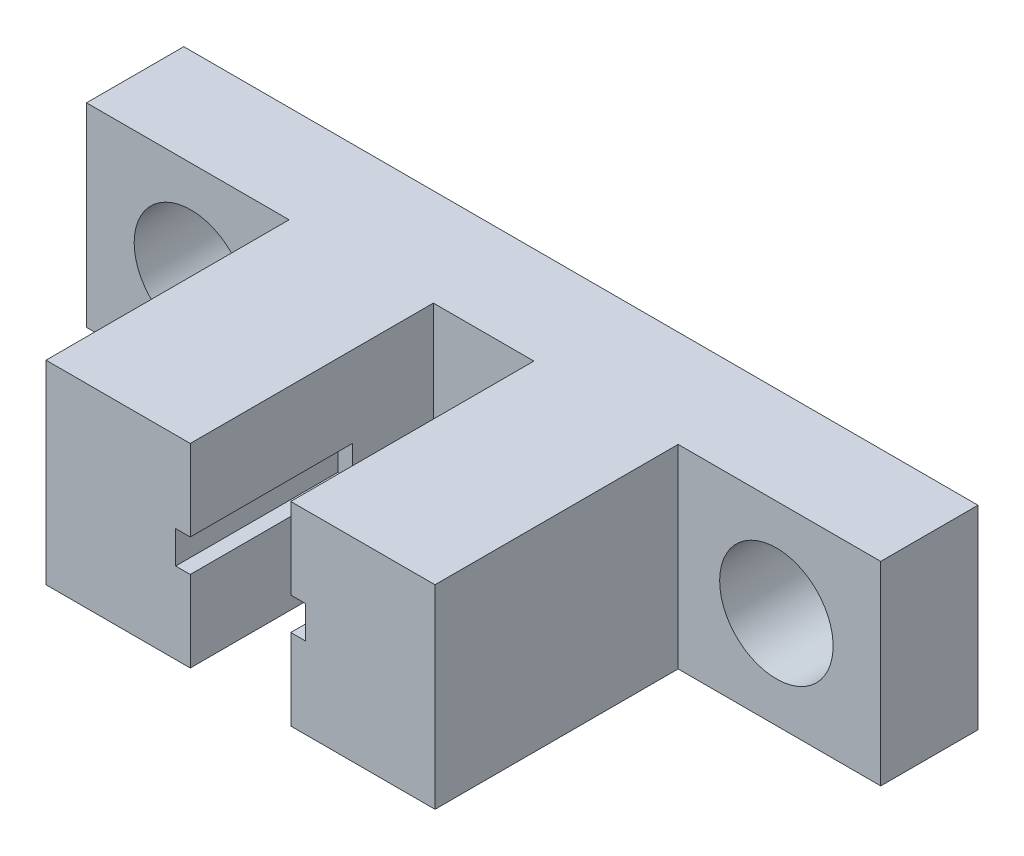
ISO-10303-21;
HEADER;
FILE_DESCRIPTION(('STEP AP214'),'2;1');
FILE_NAME('part.step','',(''),(''),'','','');
FILE_SCHEMA(('AUTOMOTIVE_DESIGN { 1 0 10303 214 1 1 1 1 }'));
ENDSEC;
DATA;
#1=APPLICATION_CONTEXT('core data for automotive mechanical design processes');
#2=APPLICATION_PROTOCOL_DEFINITION('international standard','automotive_design',2000,#1);
#3=PRODUCT_CONTEXT('',#1,'mechanical');
#4=PRODUCT('Part','Part','',(#3));
#5=PRODUCT_RELATED_PRODUCT_CATEGORY('part','',(#4));
#6=PRODUCT_DEFINITION_FORMATION('','',#4);
#7=PRODUCT_DEFINITION_CONTEXT('part definition',#1,'design');
#8=PRODUCT_DEFINITION('design','',#6,#7);
#9=PRODUCT_DEFINITION_SHAPE('','',#8);
#10=(LENGTH_UNIT() NAMED_UNIT(*) SI_UNIT(.MILLI.,.METRE.));
#11=(NAMED_UNIT(*) PLANE_ANGLE_UNIT() SI_UNIT($,.RADIAN.));
#12=(NAMED_UNIT(*) SI_UNIT($,.STERADIAN.) SOLID_ANGLE_UNIT());
#13=UNCERTAINTY_MEASURE_WITH_UNIT(LENGTH_MEASURE(1.E-05),#10,'distance_accuracy_value','');
#14=(GEOMETRIC_REPRESENTATION_CONTEXT(3) GLOBAL_UNCERTAINTY_ASSIGNED_CONTEXT((#13)) GLOBAL_UNIT_ASSIGNED_CONTEXT((#10,
#11,#12)) REPRESENTATION_CONTEXT('',''));
#15=CARTESIAN_POINT('',(0.,0.,0.));
#16=DIRECTION('',(0.,0.,1.));
#17=DIRECTION('',(1.,0.,0.));
#18=AXIS2_PLACEMENT_3D('',#15,#16,#17);
#19=CARTESIAN_POINT('',(0.,0.,0.));
#20=DIRECTION('',(0.,0.,-1.));
#21=DIRECTION('',(-1.,0.,0.));
#22=AXIS2_PLACEMENT_3D('',#19,#20,#21);
#23=PLANE('',#22);
#24=CARTESIAN_POINT('',(9.03033996878473,-1.87794117647056,0.));
#25=DIRECTION('',(0.,0.,-1.));
#26=DIRECTION('',(-1.,0.,0.));
#27=AXIS2_PLACEMENT_3D('',#24,#25,#26);
#28=CIRCLE('',#27,1.75);
#29=CARTESIAN_POINT('',(7.28033996878473,-1.87794117647056,0.));
#30=VERTEX_POINT('',#29);
#31=EDGE_CURVE('E266',#30,#30,#28,.T.);
#32=ORIENTED_EDGE('',*,*,#31,.T.);
#33=EDGE_LOOP('',(#32));
#34=FACE_BOUND('',#33,.T.);
#35=DIRECTION('',(0.,1.,0.));
#36=VECTOR('',#35,1.);
#37=CARTESIAN_POINT('',(6.,0.,0.));
#38=LINE('',#37,#36);
#39=CARTESIAN_POINT('',(6.,-4.87794117647056,0.));
#40=VERTEX_POINT('',#39);
#41=CARTESIAN_POINT('',(6.,1.12205882352944,0.));
#42=VERTEX_POINT('',#41);
#43=EDGE_CURVE('E256',#40,#42,#38,.T.);
#44=ORIENTED_EDGE('',*,*,#43,.F.);
#45=DIRECTION('',(1.,0.,0.));
#46=VECTOR('',#45,1.);
#47=CARTESIAN_POINT('',(0.,-4.87794117647056,0.));
#48=LINE('',#47,#46);
#49=CARTESIAN_POINT('',(12.25,-4.87794117647056,0.));
#50=VERTEX_POINT('',#49);
#51=EDGE_CURVE('E291',#40,#50,#48,.T.);
#52=ORIENTED_EDGE('',*,*,#51,.T.);
#53=DIRECTION('',(0.,1.,0.));
#54=VECTOR('',#53,1.);
#55=CARTESIAN_POINT('',(12.25,0.,0.));
#56=LINE('',#55,#54);
#57=CARTESIAN_POINT('',(12.25,1.12205882352944,0.));
#58=VERTEX_POINT('',#57);
#59=EDGE_CURVE('E288',#50,#58,#56,.T.);
#60=ORIENTED_EDGE('',*,*,#59,.T.);
#61=DIRECTION('',(1.,0.,0.));
#62=VECTOR('',#61,1.);
#63=CARTESIAN_POINT('',(0.,1.12205882352944,0.));
#64=LINE('',#63,#62);
#65=EDGE_CURVE('E298',#42,#58,#64,.T.);
#66=ORIENTED_EDGE('',*,*,#65,.F.);
#67=EDGE_LOOP('',(#44,#52,#60,#66));
#68=FACE_BOUND('',#67,.T.);
#69=ADVANCED_FACE('F51',(#34,#68),#23,.F.);
#70=CARTESIAN_POINT('',(-6.,0.,7.5));
#71=DIRECTION('',(-1.,0.,0.));
#72=DIRECTION('',(0.,0.,1.));
#73=AXIS2_PLACEMENT_3D('',#70,#71,#72);
#74=PLANE('',#73);
#75=DIRECTION('',(0.,1.,0.));
#76=VECTOR('',#75,1.);
#77=CARTESIAN_POINT('',(-6.,0.,0.));
#78=LINE('',#77,#76);
#79=CARTESIAN_POINT('',(-6.,-4.87794117647056,0.));
#80=VERTEX_POINT('',#79);
#81=CARTESIAN_POINT('',(-6.,1.12205882352944,0.));
#82=VERTEX_POINT('',#81);
#83=EDGE_CURVE('E315',#80,#82,#78,.T.);
#84=ORIENTED_EDGE('',*,*,#83,.F.);
#85=DIRECTION('',(0.,0.,-1.));
#86=VECTOR('',#85,1.);
#87=CARTESIAN_POINT('',(-6.,-4.87794117647056,7.5));
#88=LINE('',#87,#86);
#89=CARTESIAN_POINT('',(-6.,-4.87794117647056,7.5));
#90=VERTEX_POINT('',#89);
#91=EDGE_CURVE('E341',#90,#80,#88,.T.);
#92=ORIENTED_EDGE('',*,*,#91,.F.);
#93=DIRECTION('',(0.,1.,0.));
#94=VECTOR('',#93,1.);
#95=CARTESIAN_POINT('',(-6.,0.,7.5));
#96=LINE('',#95,#94);
#97=CARTESIAN_POINT('',(-6.,1.12205882352944,7.5));
#98=VERTEX_POINT('',#97);
#99=EDGE_CURVE('E316',#90,#98,#96,.T.);
#100=ORIENTED_EDGE('',*,*,#99,.T.);
#101=DIRECTION('',(0.,0.,-1.));
#102=VECTOR('',#101,1.);
#103=CARTESIAN_POINT('',(-6.,1.12205882352944,7.5));
#104=LINE('',#103,#102);
#105=EDGE_CURVE('E329',#98,#82,#104,.T.);
#106=ORIENTED_EDGE('',*,*,#105,.T.);
#107=EDGE_LOOP('',(#84,#92,#100,#106));
#108=FACE_BOUND('',#107,.T.);
#109=ADVANCED_FACE('F53',(#108),#74,.T.);
#110=CARTESIAN_POINT('',(0.,-4.87794117647056,7.5));
#111=DIRECTION('',(0.,-1.,0.));
#112=DIRECTION('',(0.,0.,-1.));
#113=AXIS2_PLACEMENT_3D('',#110,#111,#112);
#114=PLANE('',#113);
#115=ORIENTED_EDGE('',*,*,#91,.T.);
#116=CARTESIAN_POINT('',(-12.25,-4.87794117647056,0.));
#117=VERTEX_POINT('',#116);
#118=EDGE_CURVE('E292',#117,#80,#48,.T.);
#119=ORIENTED_EDGE('',*,*,#118,.F.);
#120=DIRECTION('',(0.,0.,1.));
#121=VECTOR('',#120,1.);
#122=CARTESIAN_POINT('',(-12.25,-4.87794117647056,-3.));
#123=LINE('',#122,#121);
#124=CARTESIAN_POINT('',(-12.25,-4.87794117647056,-3.));
#125=VERTEX_POINT('',#124);
#126=EDGE_CURVE('E310',#125,#117,#123,.T.);
#127=ORIENTED_EDGE('',*,*,#126,.F.);
#128=DIRECTION('',(1.,0.,0.));
#129=VECTOR('',#128,1.);
#130=CARTESIAN_POINT('',(0.,-4.87794117647056,-3.));
#131=LINE('',#130,#129);
#132=CARTESIAN_POINT('',(12.25,-4.87794117647056,-3.));
#133=VERTEX_POINT('',#132);
#134=EDGE_CURVE('E274',#125,#133,#131,.T.);
#135=ORIENTED_EDGE('',*,*,#134,.T.);
#136=DIRECTION('',(0.,0.,1.));
#137=VECTOR('',#136,1.);
#138=CARTESIAN_POINT('',(12.25,-4.87794117647056,-3.));
#139=LINE('',#138,#137);
#140=EDGE_CURVE('E312',#133,#50,#139,.T.);
#141=ORIENTED_EDGE('',*,*,#140,.T.);
#142=ORIENTED_EDGE('',*,*,#51,.F.);
#143=DIRECTION('',(0.,0.,-1.));
#144=VECTOR('',#143,1.);
#145=CARTESIAN_POINT('',(6.,-4.87794117647056,7.5));
#146=LINE('',#145,#144);
#147=CARTESIAN_POINT('',(6.,-4.87794117647056,7.5));
#148=VERTEX_POINT('',#147);
#149=EDGE_CURVE('E262',#148,#40,#146,.T.);
#150=ORIENTED_EDGE('',*,*,#149,.F.);
#151=DIRECTION('',(1.,0.,0.));
#152=VECTOR('',#151,1.);
#153=CARTESIAN_POINT('',(0.,-4.87794117647055,7.5));
#154=LINE('',#153,#152);
#155=CARTESIAN_POINT('',(1.55,-4.87794117647055,7.5));
#156=VERTEX_POINT('',#155);
#157=EDGE_CURVE('E245',#156,#148,#154,.T.);
#158=ORIENTED_EDGE('',*,*,#157,.F.);
#159=DIRECTION('',(0.,0.,-1.));
#160=VECTOR('',#159,1.);
#161=CARTESIAN_POINT('',(1.55,-4.87794117647055,7.5));
#162=LINE('',#161,#160);
#163=CARTESIAN_POINT('',(1.55,-4.87794117647055,0.));
#164=VERTEX_POINT('',#163);
#165=EDGE_CURVE('E264',#156,#164,#162,.T.);
#166=ORIENTED_EDGE('',*,*,#165,.T.);
#167=CARTESIAN_POINT('',(-1.55,-4.87794117647056,0.));
#168=VERTEX_POINT('',#167);
#169=EDGE_CURVE('E295',#168,#164,#48,.T.);
#170=ORIENTED_EDGE('',*,*,#169,.F.);
#171=DIRECTION('',(0.,0.,-1.));
#172=VECTOR('',#171,1.);
#173=CARTESIAN_POINT('',(-1.55,-4.87794117647056,7.5));
#174=LINE('',#173,#172);
#175=CARTESIAN_POINT('',(-1.55,-4.87794117647056,7.5));
#176=VERTEX_POINT('',#175);
#177=EDGE_CURVE('E338',#176,#168,#174,.T.);
#178=ORIENTED_EDGE('',*,*,#177,.F.);
#179=DIRECTION('',(-1.,0.,0.));
#180=VECTOR('',#179,1.);
#181=CARTESIAN_POINT('',(0.,-4.87794117647056,7.5));
#182=LINE('',#181,#180);
#183=EDGE_CURVE('E319',#176,#90,#182,.T.);
#184=ORIENTED_EDGE('',*,*,#183,.T.);
#185=EDGE_LOOP('',(#115,#119,#127,#135,#141,#142,#150,#158,#166,#170,#178,#184));
#186=FACE_BOUND('',#185,.T.);
#187=ADVANCED_FACE('F362',(#186),#114,.T.);
#188=CARTESIAN_POINT('',(-1.55,0.,7.5));
#189=DIRECTION('',(-1.,0.,0.));
#190=DIRECTION('',(0.,0.,1.));
#191=AXIS2_PLACEMENT_3D('',#188,#189,#190);
#192=PLANE('',#191);
#193=DIRECTION('',(0.,1.,0.));
#194=VECTOR('',#193,1.);
#195=CARTESIAN_POINT('',(-1.55,0.,2.5));
#196=LINE('',#195,#194);
#197=CARTESIAN_POINT('',(-1.55,-2.37794117647056,2.5));
#198=VERTEX_POINT('',#197);
#199=CARTESIAN_POINT('',(-1.55,-1.37794117647056,2.5));
#200=VERTEX_POINT('',#199);
#201=EDGE_CURVE('E239',#198,#200,#196,.T.);
#202=ORIENTED_EDGE('',*,*,#201,.F.);
#203=DIRECTION('',(0.,0.,1.));
#204=VECTOR('',#203,1.);
#205=CARTESIAN_POINT('',(-1.55,-2.37794117647056,7.5));
#206=LINE('',#205,#204);
#207=CARTESIAN_POINT('',(-1.55,-2.37794117647056,7.5));
#208=VERTEX_POINT('',#207);
#209=EDGE_CURVE('E236',#198,#208,#206,.T.);
#210=ORIENTED_EDGE('',*,*,#209,.T.);
#211=DIRECTION('',(0.,1.,0.));
#212=VECTOR('',#211,1.);
#213=CARTESIAN_POINT('',(-1.55,0.,7.5));
#214=LINE('',#213,#212);
#215=EDGE_CURVE('E324',#176,#208,#214,.T.);
#216=ORIENTED_EDGE('',*,*,#215,.F.);
#217=ORIENTED_EDGE('',*,*,#177,.T.);
#218=DIRECTION('',(0.,1.,0.));
#219=VECTOR('',#218,1.);
#220=CARTESIAN_POINT('',(-1.55,0.,0.));
#221=LINE('',#220,#219);
#222=CARTESIAN_POINT('',(-1.55,1.12205882352945,0.));
#223=VERTEX_POINT('',#222);
#224=EDGE_CURVE('E320',#168,#223,#221,.T.);
#225=ORIENTED_EDGE('',*,*,#224,.T.);
#226=DIRECTION('',(0.,0.,-1.));
#227=VECTOR('',#226,1.);
#228=CARTESIAN_POINT('',(-1.55,1.12205882352945,7.5));
#229=LINE('',#228,#227);
#230=CARTESIAN_POINT('',(-1.55,1.12205882352945,7.5));
#231=VERTEX_POINT('',#230);
#232=EDGE_CURVE('E335',#231,#223,#229,.T.);
#233=ORIENTED_EDGE('',*,*,#232,.F.);
#234=CARTESIAN_POINT('',(-1.55,-1.37794117647056,7.5));
#235=VERTEX_POINT('',#234);
#236=EDGE_CURVE('E323',#235,#231,#214,.T.);
#237=ORIENTED_EDGE('',*,*,#236,.F.);
#238=DIRECTION('',(0.,0.,-1.));
#239=VECTOR('',#238,1.);
#240=CARTESIAN_POINT('',(-1.55,-1.37794117647056,7.5));
#241=LINE('',#240,#239);
#242=EDGE_CURVE('E66',#235,#200,#241,.T.);
#243=ORIENTED_EDGE('',*,*,#242,.T.);
#244=EDGE_LOOP('',(#202,#210,#216,#217,#225,#233,#237,#243));
#245=FACE_BOUND('',#244,.T.);
#246=ADVANCED_FACE('F406',(#245),#192,.F.);
#247=CARTESIAN_POINT('',(0.,1.12205882352945,7.5));
#248=DIRECTION('',(0.,-1.,0.));
#249=DIRECTION('',(1.,0.,0.));
#250=AXIS2_PLACEMENT_3D('',#247,#248,#249);
#251=PLANE('',#250);
#252=ORIENTED_EDGE('',*,*,#232,.T.);
#253=CARTESIAN_POINT('',(1.55,1.12205882352945,0.));
#254=VERTEX_POINT('',#253);
#255=EDGE_CURVE('E302',#223,#254,#64,.T.);
#256=ORIENTED_EDGE('',*,*,#255,.T.);
#257=DIRECTION('',(0.,0.,-1.));
#258=VECTOR('',#257,1.);
#259=CARTESIAN_POINT('',(1.55,1.12205882352945,7.5));
#260=LINE('',#259,#258);
#261=CARTESIAN_POINT('',(1.55,1.12205882352945,7.5));
#262=VERTEX_POINT('',#261);
#263=EDGE_CURVE('E253',#262,#254,#260,.T.);
#264=ORIENTED_EDGE('',*,*,#263,.F.);
#265=DIRECTION('',(1.,0.,0.));
#266=VECTOR('',#265,1.);
#267=CARTESIAN_POINT('',(0.,1.12205882352945,7.5));
#268=LINE('',#267,#266);
#269=CARTESIAN_POINT('',(6.,1.12205882352944,7.5));
#270=VERTEX_POINT('',#269);
#271=EDGE_CURVE('E250',#262,#270,#268,.T.);
#272=ORIENTED_EDGE('',*,*,#271,.T.);
#273=DIRECTION('',(0.,0.,-1.));
#274=VECTOR('',#273,1.);
#275=CARTESIAN_POINT('',(6.,1.12205882352944,7.5));
#276=LINE('',#275,#274);
#277=EDGE_CURVE('E259',#270,#42,#276,.T.);
#278=ORIENTED_EDGE('',*,*,#277,.T.);
#279=ORIENTED_EDGE('',*,*,#65,.T.);
#280=DIRECTION('',(0.,0.,1.));
#281=VECTOR('',#280,1.);
#282=CARTESIAN_POINT('',(12.25,1.12205882352944,-3.));
#283=LINE('',#282,#281);
#284=CARTESIAN_POINT('',(12.25,1.12205882352944,-3.));
#285=VERTEX_POINT('',#284);
#286=EDGE_CURVE('E285',#285,#58,#283,.T.);
#287=ORIENTED_EDGE('',*,*,#286,.F.);
#288=DIRECTION('',(1.,0.,0.));
#289=VECTOR('',#288,1.);
#290=CARTESIAN_POINT('',(0.,1.12205882352944,-3.));
#291=LINE('',#290,#289);
#292=CARTESIAN_POINT('',(-12.25,1.12205882352944,-3.));
#293=VERTEX_POINT('',#292);
#294=EDGE_CURVE('E280',#293,#285,#291,.T.);
#295=ORIENTED_EDGE('',*,*,#294,.F.);
#296=DIRECTION('',(0.,0.,1.));
#297=VECTOR('',#296,1.);
#298=CARTESIAN_POINT('',(-12.25,1.12205882352944,-3.));
#299=LINE('',#298,#297);
#300=CARTESIAN_POINT('',(-12.25,1.12205882352944,0.));
#301=VERTEX_POINT('',#300);
#302=EDGE_CURVE('E307',#293,#301,#299,.T.);
#303=ORIENTED_EDGE('',*,*,#302,.T.);
#304=EDGE_CURVE('E299',#301,#82,#64,.T.);
#305=ORIENTED_EDGE('',*,*,#304,.T.);
#306=ORIENTED_EDGE('',*,*,#105,.F.);
#307=DIRECTION('',(-1.,0.,0.));
#308=VECTOR('',#307,1.);
#309=CARTESIAN_POINT('',(0.,1.12205882352945,7.5));
#310=LINE('',#309,#308);
#311=EDGE_CURVE('E327',#231,#98,#310,.T.);
#312=ORIENTED_EDGE('',*,*,#311,.F.);
#313=EDGE_LOOP('',(#252,#256,#264,#272,#278,#279,#287,#295,#303,#305,#306,#312));
#314=FACE_BOUND('',#313,.T.);
#315=ADVANCED_FACE('F368',(#314),#251,.F.);
#316=CARTESIAN_POINT('',(0.,0.,7.5));
#317=DIRECTION('',(0.,0.,1.));
#318=DIRECTION('',(1.,0.,0.));
#319=AXIS2_PLACEMENT_3D('',#316,#317,#318);
#320=PLANE('',#319);
#321=DIRECTION('',(1.,0.,0.));
#322=VECTOR('',#321,1.);
#323=CARTESIAN_POINT('',(-2.,-2.37794117647056,7.5));
#324=LINE('',#323,#322);
#325=CARTESIAN_POINT('',(-2.,-2.37794117647056,7.5));
#326=VERTEX_POINT('',#325);
#327=EDGE_CURVE('E211',#326,#208,#324,.T.);
#328=ORIENTED_EDGE('',*,*,#327,.F.);
#329=DIRECTION('',(0.,-1.,0.));
#330=VECTOR('',#329,1.);
#331=CARTESIAN_POINT('',(-2.,-1.37794117647056,7.5));
#332=LINE('',#331,#330);
#333=CARTESIAN_POINT('',(-2.,-1.37794117647056,7.5));
#334=VERTEX_POINT('',#333);
#335=EDGE_CURVE('E213',#334,#326,#332,.T.);
#336=ORIENTED_EDGE('',*,*,#335,.F.);
#337=DIRECTION('',(-1.,0.,0.));
#338=VECTOR('',#337,1.);
#339=CARTESIAN_POINT('',(-2.,-1.37794117647056,7.5));
#340=LINE('',#339,#338);
#341=EDGE_CURVE('E221',#235,#334,#340,.T.);
#342=ORIENTED_EDGE('',*,*,#341,.F.);
#343=ORIENTED_EDGE('',*,*,#236,.T.);
#344=ORIENTED_EDGE('',*,*,#311,.T.);
#345=ORIENTED_EDGE('',*,*,#99,.F.);
#346=ORIENTED_EDGE('',*,*,#183,.F.);
#347=ORIENTED_EDGE('',*,*,#215,.T.);
#348=EDGE_LOOP('',(#328,#336,#342,#343,#344,#345,#346,#347));
#349=FACE_BOUND('',#348,.T.);
#350=ADVANCED_FACE('F400',(#349),#320,.T.);
#351=CARTESIAN_POINT('',(-9.03033996878473,-1.87794117647056,0.));
#352=DIRECTION('',(0.,0.,-1.));
#353=DIRECTION('',(-1.,0.,0.));
#354=AXIS2_PLACEMENT_3D('',#351,#352,#353);
#355=CIRCLE('',#354,1.75);
#356=CARTESIAN_POINT('',(-10.7803399687847,-1.87794117647056,0.));
#357=VERTEX_POINT('',#356);
#358=EDGE_CURVE('E271',#357,#357,#355,.F.);
#359=ORIENTED_EDGE('',*,*,#358,.F.);
#360=EDGE_LOOP('',(#359));
#361=FACE_BOUND('',#360,.T.);
#362=ORIENTED_EDGE('',*,*,#118,.T.);
#363=ORIENTED_EDGE('',*,*,#83,.T.);
#364=ORIENTED_EDGE('',*,*,#304,.F.);
#365=DIRECTION('',(0.,1.,0.));
#366=VECTOR('',#365,1.);
#367=CARTESIAN_POINT('',(-12.25,0.,0.));
#368=LINE('',#367,#366);
#369=EDGE_CURVE('E294',#117,#301,#368,.T.);
#370=ORIENTED_EDGE('',*,*,#369,.F.);
#371=EDGE_LOOP('',(#362,#363,#364,#370));
#372=FACE_BOUND('',#371,.T.);
#373=ADVANCED_FACE('F391',(#361,#372),#23,.F.);
#374=CARTESIAN_POINT('',(12.25,0.,-3.));
#375=DIRECTION('',(1.,0.,0.));
#376=DIRECTION('',(0.,0.,-1.));
#377=AXIS2_PLACEMENT_3D('',#374,#375,#376);
#378=PLANE('',#377);
#379=ORIENTED_EDGE('',*,*,#59,.F.);
#380=ORIENTED_EDGE('',*,*,#140,.F.);
#381=DIRECTION('',(0.,1.,0.));
#382=VECTOR('',#381,1.);
#383=CARTESIAN_POINT('',(12.25,0.,-3.));
#384=LINE('',#383,#382);
#385=EDGE_CURVE('E270',#133,#285,#384,.T.);
#386=ORIENTED_EDGE('',*,*,#385,.T.);
#387=ORIENTED_EDGE('',*,*,#286,.T.);
#388=EDGE_LOOP('',(#379,#380,#386,#387));
#389=FACE_BOUND('',#388,.T.);
#390=ADVANCED_FACE('F379',(#389),#378,.T.);
#391=CARTESIAN_POINT('',(-12.25,0.,-3.));
#392=DIRECTION('',(1.,0.,0.));
#393=DIRECTION('',(0.,0.,-1.));
#394=AXIS2_PLACEMENT_3D('',#391,#392,#393);
#395=PLANE('',#394);
#396=ORIENTED_EDGE('',*,*,#369,.T.);
#397=ORIENTED_EDGE('',*,*,#302,.F.);
#398=DIRECTION('',(0.,1.,0.));
#399=VECTOR('',#398,1.);
#400=CARTESIAN_POINT('',(-12.25,0.,-3.));
#401=LINE('',#400,#399);
#402=EDGE_CURVE('E277',#125,#293,#401,.T.);
#403=ORIENTED_EDGE('',*,*,#402,.F.);
#404=ORIENTED_EDGE('',*,*,#126,.T.);
#405=EDGE_LOOP('',(#396,#397,#403,#404));
#406=FACE_BOUND('',#405,.T.);
#407=ADVANCED_FACE('F387',(#406),#395,.F.);
#408=CARTESIAN_POINT('',(9.03033996878473,-1.87794117647056,-3.));
#409=DIRECTION('',(0.,0.,1.));
#410=DIRECTION('',(1.,0.,0.));
#411=AXIS2_PLACEMENT_3D('',#408,#409,#410);
#412=CYLINDRICAL_SURFACE('',#411,1.75);
#413=CARTESIAN_POINT('',(9.03033996878473,-1.87794117647056,-3.));
#414=DIRECTION('',(0.,0.,-1.));
#415=DIRECTION('',(-1.,0.,0.));
#416=AXIS2_PLACEMENT_3D('',#413,#414,#415);
#417=CIRCLE('',#416,1.75);
#418=CARTESIAN_POINT('',(7.28033996878473,-1.87794117647056,-3.));
#419=VERTEX_POINT('',#418);
#420=EDGE_CURVE('E267',#419,#419,#417,.T.);
#421=ORIENTED_EDGE('',*,*,#420,.T.);
#422=EDGE_LOOP('',(#421));
#423=FACE_BOUND('',#422,.T.);
#424=ORIENTED_EDGE('',*,*,#31,.F.);
#425=EDGE_LOOP('',(#424));
#426=FACE_BOUND('',#425,.T.);
#427=ADVANCED_FACE('F446',(#423,#426),#412,.F.);
#428=CARTESIAN_POINT('',(-9.03033996878473,-1.87794117647056,-3.));
#429=DIRECTION('',(0.,0.,1.));
#430=DIRECTION('',(1.,0.,0.));
#431=AXIS2_PLACEMENT_3D('',#428,#429,#430);
#432=CYLINDRICAL_SURFACE('',#431,1.75);
#433=CARTESIAN_POINT('',(-9.03033996878473,-1.87794117647056,-3.));
#434=DIRECTION('',(0.,0.,-1.));
#435=DIRECTION('',(-1.,0.,0.));
#436=AXIS2_PLACEMENT_3D('',#433,#434,#435);
#437=CIRCLE('',#436,1.75);
#438=CARTESIAN_POINT('',(-10.7803399687847,-1.87794117647056,-3.));
#439=VERTEX_POINT('',#438);
#440=EDGE_CURVE('E282',#439,#439,#437,.F.);
#441=ORIENTED_EDGE('',*,*,#440,.F.);
#442=EDGE_LOOP('',(#441));
#443=FACE_BOUND('',#442,.T.);
#444=ORIENTED_EDGE('',*,*,#358,.T.);
#445=EDGE_LOOP('',(#444));
#446=FACE_BOUND('',#445,.T.);
#447=ADVANCED_FACE('F441',(#443,#446),#432,.F.);
#448=CARTESIAN_POINT('',(0.,0.,-3.));
#449=DIRECTION('',(0.,0.,-1.));
#450=DIRECTION('',(-1.,0.,0.));
#451=AXIS2_PLACEMENT_3D('',#448,#449,#450);
#452=PLANE('',#451);
#453=ORIENTED_EDGE('',*,*,#420,.F.);
#454=EDGE_LOOP('',(#453));
#455=FACE_BOUND('',#454,.T.);
#456=ORIENTED_EDGE('',*,*,#385,.F.);
#457=ORIENTED_EDGE('',*,*,#134,.F.);
#458=ORIENTED_EDGE('',*,*,#402,.T.);
#459=ORIENTED_EDGE('',*,*,#294,.T.);
#460=EDGE_LOOP('',(#456,#457,#458,#459));
#461=FACE_BOUND('',#460,.T.);
#462=ORIENTED_EDGE('',*,*,#440,.T.);
#463=EDGE_LOOP('',(#462));
#464=FACE_BOUND('',#463,.T.);
#465=ADVANCED_FACE('F384',(#455,#461,#464),#452,.T.);
#466=ORIENTED_EDGE('',*,*,#169,.T.);
#467=DIRECTION('',(0.,1.,0.));
#468=VECTOR('',#467,1.);
#469=CARTESIAN_POINT('',(1.55,0.,0.));
#470=LINE('',#469,#468);
#471=EDGE_CURVE('E241',#164,#254,#470,.T.);
#472=ORIENTED_EDGE('',*,*,#471,.T.);
#473=ORIENTED_EDGE('',*,*,#255,.F.);
#474=ORIENTED_EDGE('',*,*,#224,.F.);
#475=EDGE_LOOP('',(#466,#472,#473,#474));
#476=FACE_BOUND('',#475,.T.);
#477=ADVANCED_FACE('F372',(#476),#23,.F.);
#478=CARTESIAN_POINT('',(1.55,0.,7.5));
#479=DIRECTION('',(-1.,0.,0.));
#480=DIRECTION('',(0.,0.,1.));
#481=AXIS2_PLACEMENT_3D('',#478,#479,#480);
#482=PLANE('',#481);
#483=DIRECTION('',(0.,0.,1.));
#484=VECTOR('',#483,1.);
#485=CARTESIAN_POINT('',(1.55,-2.37794117647056,7.5));
#486=LINE('',#485,#484);
#487=CARTESIAN_POINT('',(1.55,-2.37794117647056,2.5));
#488=VERTEX_POINT('',#487);
#489=CARTESIAN_POINT('',(1.55,-2.37794117647056,7.5));
#490=VERTEX_POINT('',#489);
#491=EDGE_CURVE('E234',#488,#490,#486,.T.);
#492=ORIENTED_EDGE('',*,*,#491,.F.);
#493=DIRECTION('',(0.,1.,0.));
#494=VECTOR('',#493,1.);
#495=CARTESIAN_POINT('',(1.55,0.,2.5));
#496=LINE('',#495,#494);
#497=CARTESIAN_POINT('',(1.55,-1.37794117647056,2.5));
#498=VERTEX_POINT('',#497);
#499=EDGE_CURVE('E13',#488,#498,#496,.T.);
#500=ORIENTED_EDGE('',*,*,#499,.T.);
#501=DIRECTION('',(0.,0.,-1.));
#502=VECTOR('',#501,1.);
#503=CARTESIAN_POINT('',(1.55,-1.37794117647056,7.5));
#504=LINE('',#503,#502);
#505=CARTESIAN_POINT('',(1.55,-1.37794117647056,7.5));
#506=VERTEX_POINT('',#505);
#507=EDGE_CURVE('E202',#506,#498,#504,.T.);
#508=ORIENTED_EDGE('',*,*,#507,.F.);
#509=DIRECTION('',(0.,1.,0.));
#510=VECTOR('',#509,1.);
#511=CARTESIAN_POINT('',(1.55,0.,7.5));
#512=LINE('',#511,#510);
#513=EDGE_CURVE('E246',#506,#262,#512,.T.);
#514=ORIENTED_EDGE('',*,*,#513,.T.);
#515=ORIENTED_EDGE('',*,*,#263,.T.);
#516=ORIENTED_EDGE('',*,*,#471,.F.);
#517=ORIENTED_EDGE('',*,*,#165,.F.);
#518=EDGE_CURVE('E242',#156,#490,#512,.T.);
#519=ORIENTED_EDGE('',*,*,#518,.T.);
#520=EDGE_LOOP('',(#492,#500,#508,#514,#515,#516,#517,#519));
#521=FACE_BOUND('',#520,.T.);
#522=ADVANCED_FACE('F353',(#521),#482,.T.);
#523=CARTESIAN_POINT('',(6.,0.,7.5));
#524=DIRECTION('',(-1.,0.,0.));
#525=DIRECTION('',(0.,0.,1.));
#526=AXIS2_PLACEMENT_3D('',#523,#524,#525);
#527=PLANE('',#526);
#528=ORIENTED_EDGE('',*,*,#43,.T.);
#529=ORIENTED_EDGE('',*,*,#277,.F.);
#530=DIRECTION('',(0.,1.,0.));
#531=VECTOR('',#530,1.);
#532=CARTESIAN_POINT('',(6.,0.,7.5));
#533=LINE('',#532,#531);
#534=EDGE_CURVE('E248',#148,#270,#533,.T.);
#535=ORIENTED_EDGE('',*,*,#534,.F.);
#536=ORIENTED_EDGE('',*,*,#149,.T.);
#537=EDGE_LOOP('',(#528,#529,#535,#536));
#538=FACE_BOUND('',#537,.T.);
#539=ADVANCED_FACE('F365',(#538),#527,.F.);
#540=CARTESIAN_POINT('',(0.,0.,7.5));
#541=DIRECTION('',(0.,0.,1.));
#542=DIRECTION('',(1.,0.,0.));
#543=AXIS2_PLACEMENT_3D('',#540,#541,#542);
#544=PLANE('',#543);
#545=DIRECTION('',(1.,0.,0.));
#546=VECTOR('',#545,1.);
#547=CARTESIAN_POINT('',(0.,-2.37794117647056,7.5));
#548=LINE('',#547,#546);
#549=CARTESIAN_POINT('',(2.,-2.37794117647056,7.5));
#550=VERTEX_POINT('',#549);
#551=EDGE_CURVE('E59',#490,#550,#548,.T.);
#552=ORIENTED_EDGE('',*,*,#551,.F.);
#553=ORIENTED_EDGE('',*,*,#518,.F.);
#554=ORIENTED_EDGE('',*,*,#157,.T.);
#555=ORIENTED_EDGE('',*,*,#534,.T.);
#556=ORIENTED_EDGE('',*,*,#271,.F.);
#557=ORIENTED_EDGE('',*,*,#513,.F.);
#558=CARTESIAN_POINT('',(2.,-1.37794117647056,7.5));
#559=VERTEX_POINT('',#558);
#560=EDGE_CURVE('E222',#559,#506,#340,.T.);
#561=ORIENTED_EDGE('',*,*,#560,.F.);
#562=DIRECTION('',(0.,1.,0.));
#563=VECTOR('',#562,1.);
#564=CARTESIAN_POINT('',(2.,-1.37794117647056,7.5));
#565=LINE('',#564,#563);
#566=EDGE_CURVE('E74',#550,#559,#565,.T.);
#567=ORIENTED_EDGE('',*,*,#566,.F.);
#568=EDGE_LOOP('',(#552,#553,#554,#555,#556,#557,#561,#567));
#569=FACE_BOUND('',#568,.T.);
#570=ADVANCED_FACE('F349',(#569),#544,.T.);
#571=CARTESIAN_POINT('',(-2.,-1.37794117647056,2.5));
#572=DIRECTION('',(0.,1.,0.));
#573=DIRECTION('',(0.,0.,1.));
#574=AXIS2_PLACEMENT_3D('',#571,#572,#573);
#575=PLANE('',#574);
#576=ORIENTED_EDGE('',*,*,#507,.T.);
#577=DIRECTION('',(-1.,0.,0.));
#578=VECTOR('',#577,1.);
#579=CARTESIAN_POINT('',(-2.,-1.37794117647056,2.5));
#580=LINE('',#579,#578);
#581=CARTESIAN_POINT('',(2.,-1.37794117647056,2.5));
#582=VERTEX_POINT('',#581);
#583=EDGE_CURVE('E199',#582,#498,#580,.T.);
#584=ORIENTED_EDGE('',*,*,#583,.F.);
#585=DIRECTION('',(0.,0.,1.));
#586=VECTOR('',#585,1.);
#587=CARTESIAN_POINT('',(2.,-1.37794117647056,2.5));
#588=LINE('',#587,#586);
#589=EDGE_CURVE('E188',#582,#559,#588,.T.);
#590=ORIENTED_EDGE('',*,*,#589,.T.);
#591=ORIENTED_EDGE('',*,*,#560,.T.);
#592=EDGE_LOOP('',(#576,#584,#590,#591));
#593=FACE_BOUND('',#592,.T.);
#594=ADVANCED_FACE('F200',(#593),#575,.F.);
#595=CARTESIAN_POINT('',(-2.,-2.37794117647056,2.5));
#596=DIRECTION('',(0.,-1.,0.));
#597=DIRECTION('',(0.,0.,-1.));
#598=AXIS2_PLACEMENT_3D('',#595,#596,#597);
#599=PLANE('',#598);
#600=ORIENTED_EDGE('',*,*,#491,.T.);
#601=ORIENTED_EDGE('',*,*,#551,.T.);
#602=DIRECTION('',(0.,0.,1.));
#603=VECTOR('',#602,1.);
#604=CARTESIAN_POINT('',(2.,-2.37794117647056,2.5));
#605=LINE('',#604,#603);
#606=CARTESIAN_POINT('',(2.,-2.37794117647056,2.5));
#607=VERTEX_POINT('',#606);
#608=EDGE_CURVE('E226',#607,#550,#605,.T.);
#609=ORIENTED_EDGE('',*,*,#608,.F.);
#610=DIRECTION('',(1.,0.,0.));
#611=VECTOR('',#610,1.);
#612=CARTESIAN_POINT('',(-2.,-2.37794117647056,2.5));
#613=LINE('',#612,#611);
#614=EDGE_CURVE('E209',#488,#607,#613,.T.);
#615=ORIENTED_EDGE('',*,*,#614,.F.);
#616=EDGE_LOOP('',(#600,#601,#609,#615));
#617=FACE_BOUND('',#616,.T.);
#618=ADVANCED_FACE('F345',(#617),#599,.F.);
#619=CARTESIAN_POINT('',(2.,-1.37794117647056,2.5));
#620=DIRECTION('',(1.,0.,0.));
#621=DIRECTION('',(0.,0.,-1.));
#622=AXIS2_PLACEMENT_3D('',#619,#620,#621);
#623=PLANE('',#622);
#624=ORIENTED_EDGE('',*,*,#566,.T.);
#625=ORIENTED_EDGE('',*,*,#589,.F.);
#626=DIRECTION('',(0.,1.,0.));
#627=VECTOR('',#626,1.);
#628=CARTESIAN_POINT('',(2.,-1.37794117647056,2.5));
#629=LINE('',#628,#627);
#630=EDGE_CURVE('E192',#607,#582,#629,.T.);
#631=ORIENTED_EDGE('',*,*,#630,.F.);
#632=ORIENTED_EDGE('',*,*,#608,.T.);
#633=EDGE_LOOP('',(#624,#625,#631,#632));
#634=FACE_BOUND('',#633,.T.);
#635=ADVANCED_FACE('F190',(#634),#623,.F.);
#636=CARTESIAN_POINT('',(0.,0.,2.5));
#637=DIRECTION('',(0.,0.,1.));
#638=DIRECTION('',(1.,0.,0.));
#639=AXIS2_PLACEMENT_3D('',#636,#637,#638);
#640=PLANE('',#639);
#641=ORIENTED_EDGE('',*,*,#614,.T.);
#642=ORIENTED_EDGE('',*,*,#630,.T.);
#643=ORIENTED_EDGE('',*,*,#583,.T.);
#644=ORIENTED_EDGE('',*,*,#499,.F.);
#645=EDGE_LOOP('',(#641,#642,#643,#644));
#646=FACE_BOUND('',#645,.T.);
#647=ADVANCED_FACE('F207',(#646),#640,.T.);
#648=ORIENTED_EDGE('',*,*,#201,.T.);
#649=CARTESIAN_POINT('',(-2.,-1.37794117647056,2.5));
#650=VERTEX_POINT('',#649);
#651=EDGE_CURVE('E205',#200,#650,#580,.T.);
#652=ORIENTED_EDGE('',*,*,#651,.T.);
#653=DIRECTION('',(0.,-1.,0.));
#654=VECTOR('',#653,1.);
#655=CARTESIAN_POINT('',(-2.,-1.37794117647056,2.5));
#656=LINE('',#655,#654);
#657=CARTESIAN_POINT('',(-2.,-2.37794117647056,2.5));
#658=VERTEX_POINT('',#657);
#659=EDGE_CURVE('E204',#650,#658,#656,.T.);
#660=ORIENTED_EDGE('',*,*,#659,.T.);
#661=EDGE_CURVE('E196',#658,#198,#613,.T.);
#662=ORIENTED_EDGE('',*,*,#661,.T.);
#663=EDGE_LOOP('',(#648,#652,#660,#662));
#664=FACE_BOUND('',#663,.T.);
#665=ADVANCED_FACE('F417',(#664),#640,.T.);
#666=ORIENTED_EDGE('',*,*,#661,.F.);
#667=DIRECTION('',(0.,0.,1.));
#668=VECTOR('',#667,1.);
#669=CARTESIAN_POINT('',(-2.,-2.37794117647056,2.5));
#670=LINE('',#669,#668);
#671=EDGE_CURVE('E228',#658,#326,#670,.T.);
#672=ORIENTED_EDGE('',*,*,#671,.T.);
#673=ORIENTED_EDGE('',*,*,#327,.T.);
#674=ORIENTED_EDGE('',*,*,#209,.F.);
#675=EDGE_LOOP('',(#666,#672,#673,#674));
#676=FACE_BOUND('',#675,.T.);
#677=ADVANCED_FACE('F410',(#676),#599,.F.);
#678=ORIENTED_EDGE('',*,*,#341,.T.);
#679=DIRECTION('',(0.,0.,1.));
#680=VECTOR('',#679,1.);
#681=CARTESIAN_POINT('',(-2.,-1.37794117647056,2.5));
#682=LINE('',#681,#680);
#683=EDGE_CURVE('E195',#650,#334,#682,.T.);
#684=ORIENTED_EDGE('',*,*,#683,.F.);
#685=ORIENTED_EDGE('',*,*,#651,.F.);
#686=ORIENTED_EDGE('',*,*,#242,.F.);
#687=EDGE_LOOP('',(#678,#684,#685,#686));
#688=FACE_BOUND('',#687,.T.);
#689=ADVANCED_FACE('F415',(#688),#575,.F.);
#690=CARTESIAN_POINT('',(-2.,-1.37794117647056,2.5));
#691=DIRECTION('',(-1.,0.,0.));
#692=DIRECTION('',(0.,-1.,0.));
#693=AXIS2_PLACEMENT_3D('',#690,#691,#692);
#694=PLANE('',#693);
#695=ORIENTED_EDGE('',*,*,#335,.T.);
#696=ORIENTED_EDGE('',*,*,#671,.F.);
#697=ORIENTED_EDGE('',*,*,#659,.F.);
#698=ORIENTED_EDGE('',*,*,#683,.T.);
#699=EDGE_LOOP('',(#695,#696,#697,#698));
#700=FACE_BOUND('',#699,.T.);
#701=ADVANCED_FACE('F413',(#700),#694,.F.);
#702=CLOSED_SHELL('',(#69,#109,#187,#246,#315,#350,#373,#390,#407,#427,#447,#465,#477,#522,#539,
#570,#594,#618,#635,#647,#665,#677,#689,#701));
#703=MANIFOLD_SOLID_BREP('B2',#702);
#704=ADVANCED_BREP_SHAPE_REPRESENTATION('',(#18,#703),#14);
#705=SHAPE_DEFINITION_REPRESENTATION(#9,#704);
ENDSEC;
END-ISO-10303-21;
